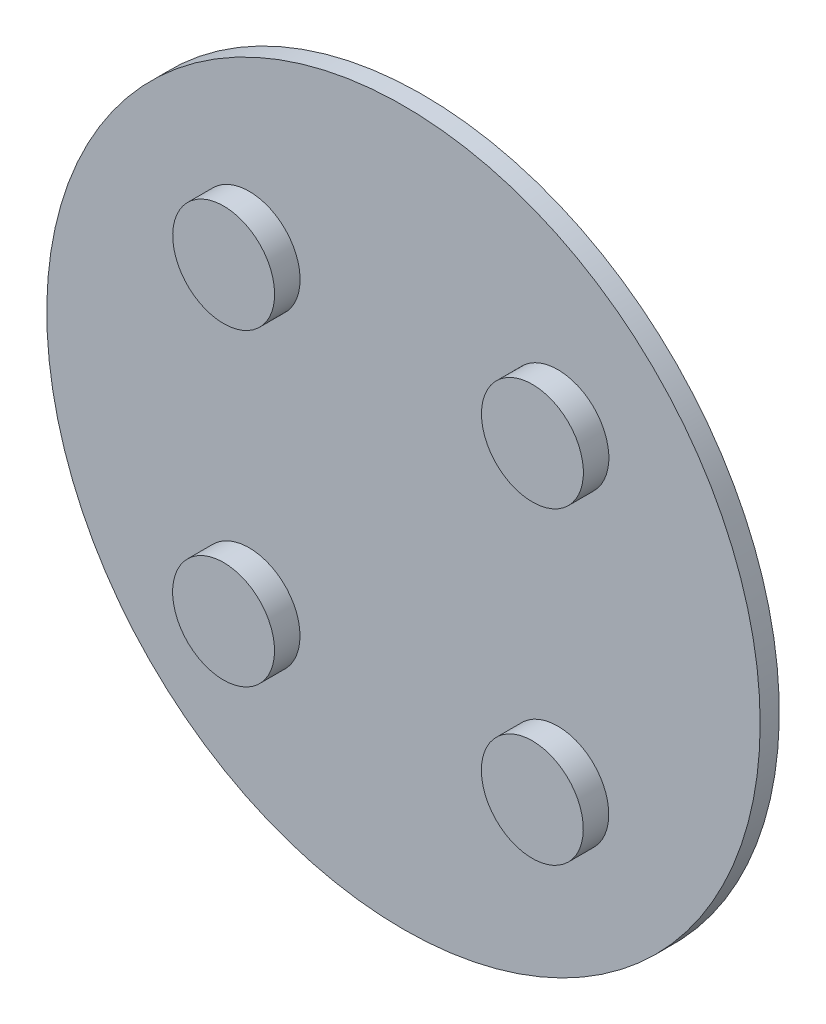
ISO-10303-21;
HEADER;
FILE_DESCRIPTION(('STEP AP214'),'2;1');
FILE_NAME('part.step','',(''),(''),'','','');
FILE_SCHEMA(('AUTOMOTIVE_DESIGN { 1 0 10303 214 1 1 1 1 }'));
ENDSEC;
DATA;
#1=APPLICATION_CONTEXT('core data for automotive mechanical design processes');
#2=APPLICATION_PROTOCOL_DEFINITION('international standard','automotive_design',2000,#1);
#3=PRODUCT_CONTEXT('',#1,'mechanical');
#4=PRODUCT('Part','Part','',(#3));
#5=PRODUCT_RELATED_PRODUCT_CATEGORY('part','',(#4));
#6=PRODUCT_DEFINITION_FORMATION('','',#4);
#7=PRODUCT_DEFINITION_CONTEXT('part definition',#1,'design');
#8=PRODUCT_DEFINITION('design','',#6,#7);
#9=PRODUCT_DEFINITION_SHAPE('','',#8);
#10=(LENGTH_UNIT() NAMED_UNIT(*) SI_UNIT(.MILLI.,.METRE.));
#11=(NAMED_UNIT(*) PLANE_ANGLE_UNIT() SI_UNIT($,.RADIAN.));
#12=(NAMED_UNIT(*) SI_UNIT($,.STERADIAN.) SOLID_ANGLE_UNIT());
#13=UNCERTAINTY_MEASURE_WITH_UNIT(LENGTH_MEASURE(1.E-05),#10,'distance_accuracy_value','');
#14=(GEOMETRIC_REPRESENTATION_CONTEXT(3) GLOBAL_UNCERTAINTY_ASSIGNED_CONTEXT((#13)) GLOBAL_UNIT_ASSIGNED_CONTEXT((#10,
#11,#12)) REPRESENTATION_CONTEXT('',''));
#15=CARTESIAN_POINT('',(0.,0.,0.));
#16=DIRECTION('',(0.,0.,1.));
#17=DIRECTION('',(1.,0.,0.));
#18=AXIS2_PLACEMENT_3D('',#15,#16,#17);
#19=CARTESIAN_POINT('',(-32.8191520607675,-25.1684486383158,35.));
#20=DIRECTION('',(0.,0.,1.));
#21=DIRECTION('',(1.,0.,0.));
#22=AXIS2_PLACEMENT_3D('',#19,#20,#21);
#23=PLANE('',#22);
#24=DIRECTION('',(-1.,0.,0.));
#25=VECTOR('',#24,1.);
#26=CARTESIAN_POINT('',(-105.297176149252,2.96816695429942,35.));
#27=LINE('',#26,#25);
#28=CARTESIAN_POINT('',(43.4080909243804,2.96816695429942,35.));
#29=VERTEX_POINT('',#28);
#30=CARTESIAN_POINT('',(-105.297176149252,2.96816695429942,35.));
#31=VERTEX_POINT('',#30);
#32=EDGE_CURVE('E194',#29,#31,#27,.T.);
#33=ORIENTED_EDGE('',*,*,#32,.T.);
#34=DIRECTION('',(0.,-1.,0.));
#35=VECTOR('',#34,1.);
#36=CARTESIAN_POINT('',(-105.297176149252,2.96816695429942,35.));
#37=LINE('',#36,#35);
#38=CARTESIAN_POINT('',(-105.297176149252,-47.0004010818802,35.));
#39=VERTEX_POINT('',#38);
#40=EDGE_CURVE('E184',#31,#39,#37,.T.);
#41=ORIENTED_EDGE('',*,*,#40,.T.);
#42=DIRECTION('',(1.,0.,0.));
#43=VECTOR('',#42,1.);
#44=CARTESIAN_POINT('',(-105.297176149252,-47.0004010818802,35.));
#45=LINE('',#44,#43);
#46=CARTESIAN_POINT('',(43.4080909243804,-47.0004010818802,35.));
#47=VERTEX_POINT('',#46);
#48=EDGE_CURVE('E187',#39,#47,#45,.T.);
#49=ORIENTED_EDGE('',*,*,#48,.T.);
#50=DIRECTION('',(0.,1.,0.));
#51=VECTOR('',#50,1.);
#52=CARTESIAN_POINT('',(43.4080909243804,2.96816695429942,35.));
#53=LINE('',#52,#51);
#54=EDGE_CURVE('E191',#47,#29,#53,.T.);
#55=ORIENTED_EDGE('',*,*,#54,.T.);
#56=EDGE_LOOP('',(#33,#41,#49,#55));
#57=FACE_BOUND('',#56,.T.);
#58=DIRECTION('',(0.,-1.,0.));
#59=VECTOR('',#58,1.);
#60=CARTESIAN_POINT('',(30.0381870722196,-217.862258767309,35.));
#61=LINE('',#60,#59);
#62=CARTESIAN_POINT('',(30.0381870722196,-217.862258767309,35.));
#63=VERTEX_POINT('',#62);
#64=CARTESIAN_POINT('',(30.0381870722196,-290.453235552407,35.));
#65=VERTEX_POINT('',#64);
#66=EDGE_CURVE('E131',#63,#65,#61,.T.);
#67=ORIENTED_EDGE('',*,*,#66,.F.);
#68=DIRECTION('',(1.,0.,0.));
#69=VECTOR('',#68,1.);
#70=CARTESIAN_POINT('',(30.0381870722196,-217.862258767309,35.));
#71=LINE('',#70,#69);
#72=CARTESIAN_POINT('',(-122.395833356434,-217.862258767309,35.));
#73=VERTEX_POINT('',#72);
#74=EDGE_CURVE('E54',#73,#63,#71,.T.);
#75=ORIENTED_EDGE('',*,*,#74,.F.);
#76=DIRECTION('',(0.,1.,0.));
#77=VECTOR('',#76,1.);
#78=CARTESIAN_POINT('',(-122.395833356434,-217.862258767309,35.));
#79=LINE('',#78,#77);
#80=CARTESIAN_POINT('',(-122.395833356434,-290.453235552407,35.));
#81=VERTEX_POINT('',#80);
#82=EDGE_CURVE('E475',#81,#73,#79,.T.);
#83=ORIENTED_EDGE('',*,*,#82,.F.);
#84=CARTESIAN_POINT('',(-32.8191520607675,-25.1684486383158,35.));
#85=DIRECTION('',(0.,0.,1.));
#86=DIRECTION('',(1.,0.,0.));
#87=AXIS2_PLACEMENT_3D('',#84,#85,#86);
#88=CIRCLE('',#87,280.);
#89=EDGE_CURVE('E159',#81,#81,#88,.T.);
#90=ORIENTED_EDGE('',*,*,#89,.F.);
#91=DIRECTION('',(-1.,0.,0.));
#92=VECTOR('',#91,1.);
#93=CARTESIAN_POINT('',(30.0381870722196,-290.453235552407,35.));
#94=LINE('',#93,#92);
#95=EDGE_CURVE('E48',#65,#81,#94,.T.);
#96=ORIENTED_EDGE('',*,*,#95,.F.);
#97=EDGE_LOOP('',(#67,#75,#83,#90,#96));
#98=FACE_BOUND('',#97,.T.);
#99=ADVANCED_FACE('F33',(#57,#98),#23,.F.);
#100=CARTESIAN_POINT('',(-32.8191520607675,-16.9399199553482,15.));
#101=DIRECTION('',(0.,0.,1.));
#102=DIRECTION('',(1.,0.,0.));
#103=AXIS2_PLACEMENT_3D('',#100,#101,#102);
#104=PLANE('',#103);
#105=CARTESIAN_POINT('',(-32.8191520607675,-16.9399199553482,15.));
#106=DIRECTION('',(0.,0.,1.));
#107=DIRECTION('',(1.,0.,0.));
#108=AXIS2_PLACEMENT_3D('',#105,#106,#107);
#109=CIRCLE('',#108,200.);
#110=CARTESIAN_POINT('',(167.180847939233,-16.9399199553482,15.));
#111=VERTEX_POINT('',#110);
#112=EDGE_CURVE('E11',#111,#111,#109,.T.);
#113=ORIENTED_EDGE('',*,*,#112,.T.);
#114=EDGE_LOOP('',(#113));
#115=FACE_BOUND('',#114,.T.);
#116=DIRECTION('',(1.,0.,0.));
#117=VECTOR('',#116,1.);
#118=CARTESIAN_POINT('',(-105.297176149252,-47.0004010818802,15.));
#119=LINE('',#118,#117);
#120=CARTESIAN_POINT('',(-105.297176149252,-47.0004010818802,15.));
#121=VERTEX_POINT('',#120);
#122=CARTESIAN_POINT('',(43.4080909243804,-47.0004010818802,15.));
#123=VERTEX_POINT('',#122);
#124=EDGE_CURVE('E200',#121,#123,#119,.T.);
#125=ORIENTED_EDGE('',*,*,#124,.F.);
#126=DIRECTION('',(0.,-1.,0.));
#127=VECTOR('',#126,1.);
#128=CARTESIAN_POINT('',(-105.297176149252,2.96816695429942,15.));
#129=LINE('',#128,#127);
#130=CARTESIAN_POINT('',(-105.297176149252,2.96816695429942,15.));
#131=VERTEX_POINT('',#130);
#132=EDGE_CURVE('E183',#131,#121,#129,.T.);
#133=ORIENTED_EDGE('',*,*,#132,.F.);
#134=DIRECTION('',(-1.,0.,0.));
#135=VECTOR('',#134,1.);
#136=CARTESIAN_POINT('',(-105.297176149252,2.96816695429942,15.));
#137=LINE('',#136,#135);
#138=CARTESIAN_POINT('',(43.4080909243804,2.96816695429943,15.));
#139=VERTEX_POINT('',#138);
#140=EDGE_CURVE('E188',#139,#131,#137,.T.);
#141=ORIENTED_EDGE('',*,*,#140,.F.);
#142=DIRECTION('',(0.,1.,0.));
#143=VECTOR('',#142,1.);
#144=CARTESIAN_POINT('',(43.4080909243804,2.96816695429942,15.));
#145=LINE('',#144,#143);
#146=EDGE_CURVE('E202',#123,#139,#145,.T.);
#147=ORIENTED_EDGE('',*,*,#146,.F.);
#148=EDGE_LOOP('',(#125,#133,#141,#147));
#149=FACE_BOUND('',#148,.T.);
#150=ADVANCED_FACE('F230',(#115,#149),#104,.T.);
#151=CARTESIAN_POINT('',(-32.8191520607675,-16.9399199553482,15.));
#152=DIRECTION('',(0.,0.,-1.));
#153=DIRECTION('',(-1.,0.,0.));
#154=AXIS2_PLACEMENT_3D('',#151,#152,#153);
#155=CYLINDRICAL_SURFACE('',#154,200.);
#156=ORIENTED_EDGE('',*,*,#112,.F.);
#157=EDGE_LOOP('',(#156));
#158=FACE_BOUND('',#157,.T.);
#159=CARTESIAN_POINT('',(-32.8191520607675,-16.9399199553482,0.));
#160=DIRECTION('',(0.,0.,1.));
#161=DIRECTION('',(1.,0.,0.));
#162=AXIS2_PLACEMENT_3D('',#159,#160,#161);
#163=CIRCLE('',#162,200.);
#164=CARTESIAN_POINT('',(167.180847939233,-16.9399199553482,0.));
#165=VERTEX_POINT('',#164);
#166=EDGE_CURVE('E37',#165,#165,#163,.T.);
#167=ORIENTED_EDGE('',*,*,#166,.T.);
#168=EDGE_LOOP('',(#167));
#169=FACE_BOUND('',#168,.T.);
#170=ADVANCED_FACE('F35',(#158,#169),#155,.T.);
#171=CARTESIAN_POINT('',(-32.8191520607675,-16.9399199553482,0.));
#172=DIRECTION('',(0.,0.,1.));
#173=DIRECTION('',(1.,0.,0.));
#174=AXIS2_PLACEMENT_3D('',#171,#172,#173);
#175=PLANE('',#174);
#176=ORIENTED_EDGE('',*,*,#166,.F.);
#177=EDGE_LOOP('',(#176));
#178=FACE_BOUND('',#177,.T.);
#179=ADVANCED_FACE('F220',(#178),#175,.F.);
#180=CARTESIAN_POINT('',(-105.297176149252,2.96816695429942,35.));
#181=DIRECTION('',(1.,0.,0.));
#182=DIRECTION('',(0.,0.,-1.));
#183=AXIS2_PLACEMENT_3D('',#180,#181,#182);
#184=PLANE('',#183);
#185=ORIENTED_EDGE('',*,*,#132,.T.);
#186=DIRECTION('',(0.,0.,-1.));
#187=VECTOR('',#186,1.);
#188=CARTESIAN_POINT('',(-105.297176149252,-47.0004010818802,35.));
#189=LINE('',#188,#187);
#190=EDGE_CURVE('E213',#39,#121,#189,.T.);
#191=ORIENTED_EDGE('',*,*,#190,.F.);
#192=ORIENTED_EDGE('',*,*,#40,.F.);
#193=DIRECTION('',(0.,0.,-1.));
#194=VECTOR('',#193,1.);
#195=CARTESIAN_POINT('',(-105.297176149252,2.96816695429942,35.));
#196=LINE('',#195,#194);
#197=EDGE_CURVE('E197',#31,#131,#196,.T.);
#198=ORIENTED_EDGE('',*,*,#197,.T.);
#199=EDGE_LOOP('',(#185,#191,#192,#198));
#200=FACE_BOUND('',#199,.T.);
#201=ADVANCED_FACE('F222',(#200),#184,.F.);
#202=CARTESIAN_POINT('',(-105.297176149252,-47.0004010818802,35.));
#203=DIRECTION('',(0.,1.,0.));
#204=DIRECTION('',(0.,0.,1.));
#205=AXIS2_PLACEMENT_3D('',#202,#203,#204);
#206=PLANE('',#205);
#207=CARTESIAN_POINT('',(-36.6024395580635,-47.0004010818802,24.7566608820939));
#208=DIRECTION('',(0.,1.,0.));
#209=DIRECTION('',(0.,0.,1.));
#210=AXIS2_PLACEMENT_3D('',#207,#208,#209);
#211=CIRCLE('',#210,8.);
#212=CARTESIAN_POINT('',(-28.8774790909171,-47.0004010818802,22.6770008663641));
#213=VERTEX_POINT('',#212);
#214=CARTESIAN_POINT('',(-28.8774790909171,-47.0004010818802,26.8363208978238));
#215=VERTEX_POINT('',#214);
#216=EDGE_CURVE('E175',#213,#215,#211,.T.);
#217=ORIENTED_EDGE('',*,*,#216,.T.);
#218=CARTESIAN_POINT('',(-21.1525186237707,-47.0004010818802,24.7566608820939));
#219=DIRECTION('',(0.,1.,0.));
#220=DIRECTION('',(0.,0.,1.));
#221=AXIS2_PLACEMENT_3D('',#218,#219,#220);
#222=CIRCLE('',#221,8.);
#223=EDGE_CURVE('E180',#215,#213,#222,.T.);
#224=ORIENTED_EDGE('',*,*,#223,.T.);
#225=EDGE_LOOP('',(#217,#224));
#226=FACE_BOUND('',#225,.T.);
#227=ORIENTED_EDGE('',*,*,#124,.T.);
#228=DIRECTION('',(0.,0.,-1.));
#229=VECTOR('',#228,1.);
#230=CARTESIAN_POINT('',(43.4080909243804,-47.0004010818802,35.));
#231=LINE('',#230,#229);
#232=EDGE_CURVE('E210',#47,#123,#231,.T.);
#233=ORIENTED_EDGE('',*,*,#232,.F.);
#234=ORIENTED_EDGE('',*,*,#48,.F.);
#235=ORIENTED_EDGE('',*,*,#190,.T.);
#236=EDGE_LOOP('',(#227,#233,#234,#235));
#237=FACE_BOUND('',#236,.T.);
#238=ADVANCED_FACE('F227',(#226,#237),#206,.F.);
#239=CARTESIAN_POINT('',(43.4080909243804,2.96816695429942,35.));
#240=DIRECTION('',(-1.,0.,0.));
#241=DIRECTION('',(0.,-1.,0.));
#242=AXIS2_PLACEMENT_3D('',#239,#240,#241);
#243=PLANE('',#242);
#244=ORIENTED_EDGE('',*,*,#146,.T.);
#245=DIRECTION('',(0.,0.,-1.));
#246=VECTOR('',#245,1.);
#247=CARTESIAN_POINT('',(43.4080909243804,2.96816695429942,35.));
#248=LINE('',#247,#246);
#249=EDGE_CURVE('E208',#29,#139,#248,.T.);
#250=ORIENTED_EDGE('',*,*,#249,.F.);
#251=ORIENTED_EDGE('',*,*,#54,.F.);
#252=ORIENTED_EDGE('',*,*,#232,.T.);
#253=EDGE_LOOP('',(#244,#250,#251,#252));
#254=FACE_BOUND('',#253,.T.);
#255=ADVANCED_FACE('F259',(#254),#243,.F.);
#256=CARTESIAN_POINT('',(-105.297176149252,2.96816695429942,35.));
#257=DIRECTION('',(0.,-1.,0.));
#258=DIRECTION('',(0.,0.,-1.));
#259=AXIS2_PLACEMENT_3D('',#256,#257,#258);
#260=PLANE('',#259);
#261=CARTESIAN_POINT('',(-36.6024395580635,2.96816695429942,24.7566608820939));
#262=DIRECTION('',(0.,1.,0.));
#263=DIRECTION('',(0.,0.,1.));
#264=AXIS2_PLACEMENT_3D('',#261,#262,#263);
#265=CIRCLE('',#264,8.);
#266=CARTESIAN_POINT('',(-28.8774790909171,2.96816695429943,22.6770008663641));
#267=VERTEX_POINT('',#266);
#268=CARTESIAN_POINT('',(-28.8774790909171,2.96816695429942,26.8363208978238));
#269=VERTEX_POINT('',#268);
#270=EDGE_CURVE('E169',#267,#269,#265,.T.);
#271=ORIENTED_EDGE('',*,*,#270,.F.);
#272=CARTESIAN_POINT('',(-21.1525186237707,2.96816695429942,24.7566608820939));
#273=DIRECTION('',(0.,1.,0.));
#274=DIRECTION('',(0.,0.,1.));
#275=AXIS2_PLACEMENT_3D('',#272,#273,#274);
#276=CIRCLE('',#275,8.);
#277=EDGE_CURVE('E165',#269,#267,#276,.T.);
#278=ORIENTED_EDGE('',*,*,#277,.F.);
#279=EDGE_LOOP('',(#271,#278));
#280=FACE_BOUND('',#279,.T.);
#281=ORIENTED_EDGE('',*,*,#140,.T.);
#282=ORIENTED_EDGE('',*,*,#197,.F.);
#283=ORIENTED_EDGE('',*,*,#32,.F.);
#284=ORIENTED_EDGE('',*,*,#249,.T.);
#285=EDGE_LOOP('',(#281,#282,#283,#284));
#286=FACE_BOUND('',#285,.T.);
#287=ADVANCED_FACE('F255',(#280,#286),#260,.F.);
#288=CARTESIAN_POINT('',(-21.1525186237707,-100.031833045701,24.7566608820939));
#289=DIRECTION('',(0.,1.,0.));
#290=DIRECTION('',(0.,0.,1.));
#291=AXIS2_PLACEMENT_3D('',#288,#289,#290);
#292=CYLINDRICAL_SURFACE('',#291,8.);
#293=DIRECTION('',(0.,1.,0.));
#294=VECTOR('',#293,1.);
#295=CARTESIAN_POINT('',(-28.8774790909171,-100.031833045701,26.8363208978238));
#296=LINE('',#295,#294);
#297=EDGE_CURVE('E173',#215,#269,#296,.T.);
#298=ORIENTED_EDGE('',*,*,#297,.T.);
#299=ORIENTED_EDGE('',*,*,#277,.T.);
#300=DIRECTION('',(0.,1.,0.));
#301=VECTOR('',#300,1.);
#302=CARTESIAN_POINT('',(-28.8774790909171,-100.031833045701,22.6770008663641));
#303=LINE('',#302,#301);
#304=EDGE_CURVE('E172',#213,#267,#303,.T.);
#305=ORIENTED_EDGE('',*,*,#304,.F.);
#306=ORIENTED_EDGE('',*,*,#223,.F.);
#307=EDGE_LOOP('',(#298,#299,#305,#306));
#308=FACE_BOUND('',#307,.T.);
#309=ADVANCED_FACE('F251',(#308),#292,.F.);
#310=CARTESIAN_POINT('',(-36.6024395580635,-100.031833045701,24.7566608820939));
#311=DIRECTION('',(0.,1.,0.));
#312=DIRECTION('',(0.,0.,1.));
#313=AXIS2_PLACEMENT_3D('',#310,#311,#312);
#314=CYLINDRICAL_SURFACE('',#313,8.);
#315=ORIENTED_EDGE('',*,*,#304,.T.);
#316=ORIENTED_EDGE('',*,*,#270,.T.);
#317=ORIENTED_EDGE('',*,*,#297,.F.);
#318=ORIENTED_EDGE('',*,*,#216,.F.);
#319=EDGE_LOOP('',(#315,#316,#317,#318));
#320=FACE_BOUND('',#319,.T.);
#321=ADVANCED_FACE('F247',(#320),#314,.F.);
#322=CARTESIAN_POINT('',(-32.8191520607675,-25.1684486383158,50.));
#323=DIRECTION('',(0.,0.,-1.));
#324=DIRECTION('',(-1.,0.,0.));
#325=AXIS2_PLACEMENT_3D('',#322,#323,#324);
#326=CYLINDRICAL_SURFACE('',#325,280.);
#327=CARTESIAN_POINT('',(-32.8191520607675,-25.1684486383158,50.));
#328=DIRECTION('',(0.,0.,1.));
#329=DIRECTION('',(1.,0.,0.));
#330=AXIS2_PLACEMENT_3D('',#327,#328,#329);
#331=CIRCLE('',#330,280.);
#332=CARTESIAN_POINT('',(247.180847939233,-25.1684486383158,50.));
#333=VERTEX_POINT('',#332);
#334=EDGE_CURVE('E162',#333,#333,#331,.T.);
#335=ORIENTED_EDGE('',*,*,#334,.F.);
#336=EDGE_LOOP('',(#335));
#337=FACE_BOUND('',#336,.T.);
#338=ORIENTED_EDGE('',*,*,#89,.T.);
#339=EDGE_LOOP('',(#338));
#340=FACE_BOUND('',#339,.T.);
#341=ADVANCED_FACE('F244',(#337,#340),#326,.T.);
#342=CARTESIAN_POINT('',(-32.8191520607675,-25.1684486383158,50.));
#343=DIRECTION('',(0.,0.,1.));
#344=DIRECTION('',(1.,0.,0.));
#345=AXIS2_PLACEMENT_3D('',#342,#343,#344);
#346=PLANE('',#345);
#347=CARTESIAN_POINT('',(-153.960004807967,96.0447113317068,50.));
#348=DIRECTION('',(0.,0.,1.));
#349=DIRECTION('',(0.,-1.,0.));
#350=AXIS2_PLACEMENT_3D('',#347,#348,#349);
#351=CIRCLE('',#350,40.);
#352=CARTESIAN_POINT('',(-153.960004807967,56.0447113317068,50.));
#353=VERTEX_POINT('',#352);
#354=EDGE_CURVE('E132',#353,#353,#351,.T.);
#355=ORIENTED_EDGE('',*,*,#354,.F.);
#356=EDGE_LOOP('',(#355));
#357=FACE_BOUND('',#356,.T.);
#358=CARTESIAN_POINT('',(88.3940079092564,95.9724041088827,50.));
#359=DIRECTION('',(0.,0.,1.));
#360=DIRECTION('',(-1.,0.,0.));
#361=AXIS2_PLACEMENT_3D('',#358,#359,#360);
#362=CIRCLE('',#361,40.);
#363=CARTESIAN_POINT('',(48.3940079092564,95.9724041088827,50.));
#364=VERTEX_POINT('',#363);
#365=EDGE_CURVE('E142',#364,#364,#362,.T.);
#366=ORIENTED_EDGE('',*,*,#365,.F.);
#367=EDGE_LOOP('',(#366));
#368=FACE_BOUND('',#367,.T.);
#369=CARTESIAN_POINT('',(88.3217006864314,-146.381608608339,50.));
#370=DIRECTION('',(0.,0.,1.));
#371=DIRECTION('',(0.,1.,0.));
#372=AXIS2_PLACEMENT_3D('',#369,#370,#371);
#373=CIRCLE('',#372,40.);
#374=CARTESIAN_POINT('',(88.3217006864313,-106.381608608339,50.));
#375=VERTEX_POINT('',#374);
#376=EDGE_CURVE('E147',#375,#375,#373,.T.);
#377=ORIENTED_EDGE('',*,*,#376,.F.);
#378=EDGE_LOOP('',(#377));
#379=FACE_BOUND('',#378,.T.);
#380=CARTESIAN_POINT('',(-154.032312030791,-146.309301385514,50.));
#381=DIRECTION('',(0.,0.,1.));
#382=DIRECTION('',(1.,0.,0.));
#383=AXIS2_PLACEMENT_3D('',#380,#381,#382);
#384=CIRCLE('',#383,40.);
#385=CARTESIAN_POINT('',(-114.032312030791,-146.309301385514,50.));
#386=VERTEX_POINT('',#385);
#387=EDGE_CURVE('E153',#386,#386,#384,.T.);
#388=ORIENTED_EDGE('',*,*,#387,.F.);
#389=EDGE_LOOP('',(#388));
#390=FACE_BOUND('',#389,.T.);
#391=ORIENTED_EDGE('',*,*,#334,.T.);
#392=EDGE_LOOP('',(#391));
#393=FACE_BOUND('',#392,.T.);
#394=ADVANCED_FACE('F242',(#357,#368,#379,#390,#393),#346,.T.);
#395=CARTESIAN_POINT('',(-154.032312030791,-146.309301385514,70.));
#396=DIRECTION('',(0.,0.,-1.));
#397=DIRECTION('',(-1.,0.,0.));
#398=AXIS2_PLACEMENT_3D('',#395,#396,#397);
#399=CYLINDRICAL_SURFACE('',#398,40.);
#400=CARTESIAN_POINT('',(-154.032312030791,-146.309301385514,70.));
#401=DIRECTION('',(0.,0.,1.));
#402=DIRECTION('',(1.,0.,0.));
#403=AXIS2_PLACEMENT_3D('',#400,#401,#402);
#404=CIRCLE('',#403,40.);
#405=CARTESIAN_POINT('',(-114.032312030791,-146.309301385514,70.));
#406=VERTEX_POINT('',#405);
#407=EDGE_CURVE('E156',#406,#406,#404,.T.);
#408=ORIENTED_EDGE('',*,*,#407,.F.);
#409=EDGE_LOOP('',(#408));
#410=FACE_BOUND('',#409,.T.);
#411=ORIENTED_EDGE('',*,*,#387,.T.);
#412=EDGE_LOOP('',(#411));
#413=FACE_BOUND('',#412,.T.);
#414=ADVANCED_FACE('F312',(#410,#413),#399,.T.);
#415=CARTESIAN_POINT('',(-154.032312030791,-146.309301385514,70.));
#416=DIRECTION('',(0.,0.,1.));
#417=DIRECTION('',(1.,0.,0.));
#418=AXIS2_PLACEMENT_3D('',#415,#416,#417);
#419=PLANE('',#418);
#420=ORIENTED_EDGE('',*,*,#407,.T.);
#421=EDGE_LOOP('',(#420));
#422=FACE_BOUND('',#421,.T.);
#423=ADVANCED_FACE('F320',(#422),#419,.T.);
#424=CARTESIAN_POINT('',(88.3217006864314,-146.381608608339,70.));
#425=DIRECTION('',(0.,0.,-1.));
#426=DIRECTION('',(-1.,0.,0.));
#427=AXIS2_PLACEMENT_3D('',#424,#425,#426);
#428=CYLINDRICAL_SURFACE('',#427,40.);
#429=CARTESIAN_POINT('',(88.3217006864314,-146.381608608339,70.));
#430=DIRECTION('',(0.,0.,1.));
#431=DIRECTION('',(0.,1.,0.));
#432=AXIS2_PLACEMENT_3D('',#429,#430,#431);
#433=CIRCLE('',#432,40.);
#434=CARTESIAN_POINT('',(88.3217006864313,-106.381608608339,70.));
#435=VERTEX_POINT('',#434);
#436=EDGE_CURVE('E150',#435,#435,#433,.T.);
#437=ORIENTED_EDGE('',*,*,#436,.F.);
#438=EDGE_LOOP('',(#437));
#439=FACE_BOUND('',#438,.T.);
#440=ORIENTED_EDGE('',*,*,#376,.T.);
#441=EDGE_LOOP('',(#440));
#442=FACE_BOUND('',#441,.T.);
#443=ADVANCED_FACE('F326',(#439,#442),#428,.T.);
#444=CARTESIAN_POINT('',(88.3217006864314,-146.381608608339,70.));
#445=DIRECTION('',(0.,0.,1.));
#446=DIRECTION('',(0.,1.,0.));
#447=AXIS2_PLACEMENT_3D('',#444,#445,#446);
#448=PLANE('',#447);
#449=ORIENTED_EDGE('',*,*,#436,.T.);
#450=EDGE_LOOP('',(#449));
#451=FACE_BOUND('',#450,.T.);
#452=ADVANCED_FACE('F333',(#451),#448,.T.);
#453=CARTESIAN_POINT('',(88.3940079092564,95.9724041088827,70.));
#454=DIRECTION('',(0.,0.,-1.));
#455=DIRECTION('',(-1.,0.,0.));
#456=AXIS2_PLACEMENT_3D('',#453,#454,#455);
#457=CYLINDRICAL_SURFACE('',#456,40.);
#458=CARTESIAN_POINT('',(88.3940079092564,95.9724041088827,70.));
#459=DIRECTION('',(0.,0.,1.));
#460=DIRECTION('',(-1.,0.,0.));
#461=AXIS2_PLACEMENT_3D('',#458,#459,#460);
#462=CIRCLE('',#461,40.);
#463=CARTESIAN_POINT('',(48.3940079092564,95.9724041088827,70.));
#464=VERTEX_POINT('',#463);
#465=EDGE_CURVE('E144',#464,#464,#462,.T.);
#466=ORIENTED_EDGE('',*,*,#465,.F.);
#467=EDGE_LOOP('',(#466));
#468=FACE_BOUND('',#467,.T.);
#469=ORIENTED_EDGE('',*,*,#365,.T.);
#470=EDGE_LOOP('',(#469));
#471=FACE_BOUND('',#470,.T.);
#472=ADVANCED_FACE('F341',(#468,#471),#457,.T.);
#473=CARTESIAN_POINT('',(88.3940079092564,95.9724041088827,70.));
#474=DIRECTION('',(0.,0.,1.));
#475=DIRECTION('',(-1.,0.,0.));
#476=AXIS2_PLACEMENT_3D('',#473,#474,#475);
#477=PLANE('',#476);
#478=ORIENTED_EDGE('',*,*,#465,.T.);
#479=EDGE_LOOP('',(#478));
#480=FACE_BOUND('',#479,.T.);
#481=ADVANCED_FACE('F349',(#480),#477,.T.);
#482=CARTESIAN_POINT('',(-153.960004807967,96.0447113317068,70.));
#483=DIRECTION('',(0.,0.,-1.));
#484=DIRECTION('',(-1.,0.,0.));
#485=AXIS2_PLACEMENT_3D('',#482,#483,#484);
#486=CYLINDRICAL_SURFACE('',#485,40.);
#487=CARTESIAN_POINT('',(-153.960004807967,96.0447113317068,70.));
#488=DIRECTION('',(0.,0.,1.));
#489=DIRECTION('',(0.,-1.,0.));
#490=AXIS2_PLACEMENT_3D('',#487,#488,#489);
#491=CIRCLE('',#490,40.);
#492=CARTESIAN_POINT('',(-153.960004807967,56.0447113317068,70.));
#493=VERTEX_POINT('',#492);
#494=EDGE_CURVE('E135',#493,#493,#491,.T.);
#495=ORIENTED_EDGE('',*,*,#494,.F.);
#496=EDGE_LOOP('',(#495));
#497=FACE_BOUND('',#496,.T.);
#498=ORIENTED_EDGE('',*,*,#354,.T.);
#499=EDGE_LOOP('',(#498));
#500=FACE_BOUND('',#499,.T.);
#501=ADVANCED_FACE('F357',(#497,#500),#486,.T.);
#502=CARTESIAN_POINT('',(-153.960004807967,96.0447113317068,70.));
#503=DIRECTION('',(0.,0.,1.));
#504=DIRECTION('',(0.,-1.,0.));
#505=AXIS2_PLACEMENT_3D('',#502,#503,#504);
#506=PLANE('',#505);
#507=ORIENTED_EDGE('',*,*,#494,.T.);
#508=EDGE_LOOP('',(#507));
#509=FACE_BOUND('',#508,.T.);
#510=ADVANCED_FACE('F365',(#509),#506,.T.);
#511=CARTESIAN_POINT('',(30.0381870722196,-217.862258767309,30.));
#512=DIRECTION('',(-1.,0.,0.));
#513=DIRECTION('',(0.,-1.,0.));
#514=AXIS2_PLACEMENT_3D('',#511,#512,#513);
#515=PLANE('',#514);
#516=ORIENTED_EDGE('',*,*,#66,.T.);
#517=DIRECTION('',(0.,0.,1.));
#518=VECTOR('',#517,1.);
#519=CARTESIAN_POINT('',(30.0381870722196,-290.453235552407,30.));
#520=LINE('',#519,#518);
#521=CARTESIAN_POINT('',(30.0381870722196,-290.453235552407,30.));
#522=VERTEX_POINT('',#521);
#523=EDGE_CURVE('E113',#522,#65,#520,.T.);
#524=ORIENTED_EDGE('',*,*,#523,.F.);
#525=DIRECTION('',(0.,-1.,0.));
#526=VECTOR('',#525,1.);
#527=CARTESIAN_POINT('',(30.0381870722196,-217.862258767309,30.));
#528=LINE('',#527,#526);
#529=CARTESIAN_POINT('',(30.0381870722196,-217.862258767309,30.));
#530=VERTEX_POINT('',#529);
#531=EDGE_CURVE('E120',#530,#522,#528,.T.);
#532=ORIENTED_EDGE('',*,*,#531,.F.);
#533=DIRECTION('',(0.,0.,1.));
#534=VECTOR('',#533,1.);
#535=CARTESIAN_POINT('',(30.0381870722196,-217.862258767309,30.));
#536=LINE('',#535,#534);
#537=EDGE_CURVE('E473',#530,#63,#536,.T.);
#538=ORIENTED_EDGE('',*,*,#537,.T.);
#539=EDGE_LOOP('',(#516,#524,#532,#538));
#540=FACE_BOUND('',#539,.T.);
#541=ADVANCED_FACE('F130',(#540),#515,.F.);
#542=CARTESIAN_POINT('',(30.0381870722196,-290.453235552407,30.));
#543=DIRECTION('',(0.,1.,0.));
#544=DIRECTION('',(0.,0.,1.));
#545=AXIS2_PLACEMENT_3D('',#542,#543,#544);
#546=PLANE('',#545);
#547=ORIENTED_EDGE('',*,*,#95,.T.);
#548=DIRECTION('',(0.,0.,1.));
#549=VECTOR('',#548,1.);
#550=CARTESIAN_POINT('',(-122.395833356434,-290.453235552407,30.));
#551=LINE('',#550,#549);
#552=CARTESIAN_POINT('',(-122.395833356434,-290.453235552407,30.));
#553=VERTEX_POINT('',#552);
#554=EDGE_CURVE('E116',#553,#81,#551,.T.);
#555=ORIENTED_EDGE('',*,*,#554,.F.);
#556=DIRECTION('',(-1.,0.,0.));
#557=VECTOR('',#556,1.);
#558=CARTESIAN_POINT('',(30.0381870722196,-290.453235552407,30.));
#559=LINE('',#558,#557);
#560=EDGE_CURVE('E109',#522,#553,#559,.T.);
#561=ORIENTED_EDGE('',*,*,#560,.F.);
#562=ORIENTED_EDGE('',*,*,#523,.T.);
#563=EDGE_LOOP('',(#547,#555,#561,#562));
#564=FACE_BOUND('',#563,.T.);
#565=ADVANCED_FACE('F111',(#564),#546,.F.);
#566=CARTESIAN_POINT('',(-122.395833356434,-217.862258767309,30.));
#567=DIRECTION('',(1.,0.,0.));
#568=DIRECTION('',(0.,1.,0.));
#569=AXIS2_PLACEMENT_3D('',#566,#567,#568);
#570=PLANE('',#569);
#571=ORIENTED_EDGE('',*,*,#82,.T.);
#572=DIRECTION('',(0.,0.,1.));
#573=VECTOR('',#572,1.);
#574=CARTESIAN_POINT('',(-122.395833356434,-217.862258767309,30.));
#575=LINE('',#574,#573);
#576=CARTESIAN_POINT('',(-122.395833356434,-217.862258767309,30.));
#577=VERTEX_POINT('',#576);
#578=EDGE_CURVE('E137',#577,#73,#575,.T.);
#579=ORIENTED_EDGE('',*,*,#578,.F.);
#580=DIRECTION('',(0.,1.,0.));
#581=VECTOR('',#580,1.);
#582=CARTESIAN_POINT('',(-122.395833356434,-217.862258767309,30.));
#583=LINE('',#582,#581);
#584=EDGE_CURVE('E119',#553,#577,#583,.T.);
#585=ORIENTED_EDGE('',*,*,#584,.F.);
#586=ORIENTED_EDGE('',*,*,#554,.T.);
#587=EDGE_LOOP('',(#571,#579,#585,#586));
#588=FACE_BOUND('',#587,.T.);
#589=ADVANCED_FACE('F385',(#588),#570,.F.);
#590=CARTESIAN_POINT('',(30.0381870722196,-217.862258767309,30.));
#591=DIRECTION('',(0.,-1.,0.));
#592=DIRECTION('',(0.,0.,-1.));
#593=AXIS2_PLACEMENT_3D('',#590,#591,#592);
#594=PLANE('',#593);
#595=ORIENTED_EDGE('',*,*,#74,.T.);
#596=ORIENTED_EDGE('',*,*,#537,.F.);
#597=DIRECTION('',(1.,0.,0.));
#598=VECTOR('',#597,1.);
#599=CARTESIAN_POINT('',(30.0381870722196,-217.862258767309,30.));
#600=LINE('',#599,#598);
#601=EDGE_CURVE('E125',#577,#530,#600,.T.);
#602=ORIENTED_EDGE('',*,*,#601,.F.);
#603=ORIENTED_EDGE('',*,*,#578,.T.);
#604=EDGE_LOOP('',(#595,#596,#602,#603));
#605=FACE_BOUND('',#604,.T.);
#606=ADVANCED_FACE('F392',(#605),#594,.F.);
#607=CARTESIAN_POINT('',(0.,0.,30.));
#608=DIRECTION('',(0.,0.,-1.));
#609=DIRECTION('',(-1.,0.,0.));
#610=AXIS2_PLACEMENT_3D('',#607,#608,#609);
#611=PLANE('',#610);
#612=ORIENTED_EDGE('',*,*,#531,.T.);
#613=ORIENTED_EDGE('',*,*,#560,.T.);
#614=ORIENTED_EDGE('',*,*,#584,.T.);
#615=ORIENTED_EDGE('',*,*,#601,.T.);
#616=EDGE_LOOP('',(#612,#613,#614,#615));
#617=FACE_BOUND('',#616,.T.);
#618=ADVANCED_FACE('F123',(#617),#611,.T.);
#619=CLOSED_SHELL('',(#99,#150,#170,#179,#201,#238,#255,#287,#309,#321,#341,#394,#414,#423,#443,
#452,#472,#481,#501,#510,#541,#565,#589,#606,#618));
#620=MANIFOLD_SOLID_BREP('B2',#619);
#621=ADVANCED_BREP_SHAPE_REPRESENTATION('',(#18,#620),#14);
#622=SHAPE_DEFINITION_REPRESENTATION(#9,#621);
ENDSEC;
END-ISO-10303-21;
